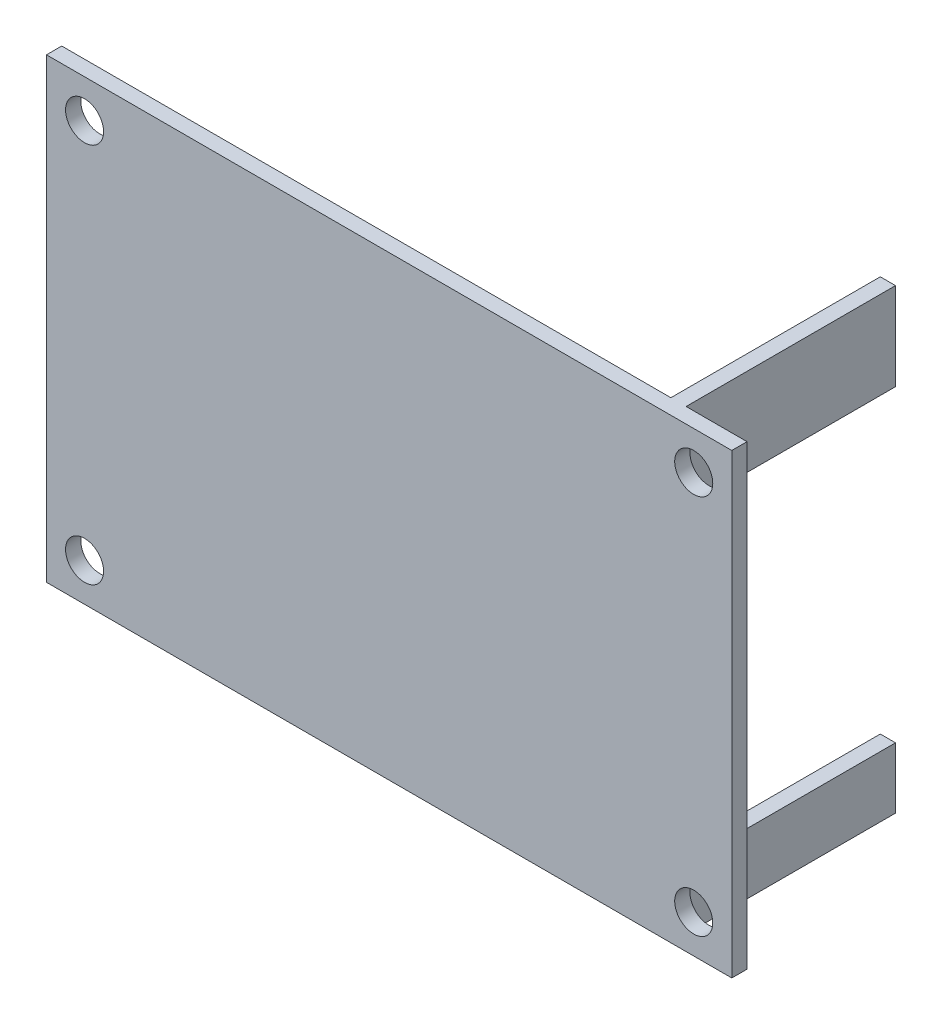
ISO-10303-21;
HEADER;
FILE_DESCRIPTION(('STEP AP214'),'2;1');
FILE_NAME('part.step','',(''),(''),'','','');
FILE_SCHEMA(('AUTOMOTIVE_DESIGN { 1 0 10303 214 1 1 1 1 }'));
ENDSEC;
DATA;
#1=APPLICATION_CONTEXT('core data for automotive mechanical design processes');
#2=APPLICATION_PROTOCOL_DEFINITION('international standard','automotive_design',2000,#1);
#3=PRODUCT_CONTEXT('',#1,'mechanical');
#4=PRODUCT('Part','Part','',(#3));
#5=PRODUCT_RELATED_PRODUCT_CATEGORY('part','',(#4));
#6=PRODUCT_DEFINITION_FORMATION('','',#4);
#7=PRODUCT_DEFINITION_CONTEXT('part definition',#1,'design');
#8=PRODUCT_DEFINITION('design','',#6,#7);
#9=PRODUCT_DEFINITION_SHAPE('','',#8);
#10=(LENGTH_UNIT() NAMED_UNIT(*) SI_UNIT(.MILLI.,.METRE.));
#11=(NAMED_UNIT(*) PLANE_ANGLE_UNIT() SI_UNIT($,.RADIAN.));
#12=(NAMED_UNIT(*) SI_UNIT($,.STERADIAN.) SOLID_ANGLE_UNIT());
#13=UNCERTAINTY_MEASURE_WITH_UNIT(LENGTH_MEASURE(1.E-05),#10,'distance_accuracy_value','');
#14=(GEOMETRIC_REPRESENTATION_CONTEXT(3) GLOBAL_UNCERTAINTY_ASSIGNED_CONTEXT((#13)) GLOBAL_UNIT_ASSIGNED_CONTEXT((#10,
#11,#12)) REPRESENTATION_CONTEXT('',''));
#15=CARTESIAN_POINT('',(0.,0.,0.));
#16=DIRECTION('',(0.,0.,1.));
#17=DIRECTION('',(1.,0.,0.));
#18=AXIS2_PLACEMENT_3D('',#15,#16,#17);
#19=CARTESIAN_POINT('',(0.,0.,-27.5));
#20=DIRECTION('',(0.,0.,1.));
#21=DIRECTION('',(1.,0.,0.));
#22=AXIS2_PLACEMENT_3D('',#19,#20,#21);
#23=PLANE('',#22);
#24=DIRECTION('',(0.,1.,0.));
#25=VECTOR('',#24,1.);
#26=CARTESIAN_POINT('',(35.,-30.,-27.5));
#27=LINE('',#26,#25);
#28=CARTESIAN_POINT('',(35.,-30.,-27.5));
#29=VERTEX_POINT('',#28);
#30=CARTESIAN_POINT('',(35.,-22.,-27.5));
#31=VERTEX_POINT('',#30);
#32=EDGE_CURVE('E154',#29,#31,#27,.T.);
#33=ORIENTED_EDGE('',*,*,#32,.T.);
#34=DIRECTION('',(1.,0.,0.));
#35=VECTOR('',#34,1.);
#36=CARTESIAN_POINT('',(0.,-22.,-27.5));
#37=LINE('',#36,#35);
#38=CARTESIAN_POINT('',(37.,-22.,-27.5));
#39=VERTEX_POINT('',#38);
#40=EDGE_CURVE('E40',#31,#39,#37,.T.);
#41=ORIENTED_EDGE('',*,*,#40,.T.);
#42=DIRECTION('',(0.,-1.,0.));
#43=VECTOR('',#42,1.);
#44=CARTESIAN_POINT('',(37.,-30.,-27.5));
#45=LINE('',#44,#43);
#46=CARTESIAN_POINT('',(37.,-30.,-27.5));
#47=VERTEX_POINT('',#46);
#48=EDGE_CURVE('E145',#39,#47,#45,.T.);
#49=ORIENTED_EDGE('',*,*,#48,.T.);
#50=DIRECTION('',(-1.,0.,0.));
#51=VECTOR('',#50,1.);
#52=CARTESIAN_POINT('',(37.,-30.,-27.5));
#53=LINE('',#52,#51);
#54=EDGE_CURVE('E144',#47,#29,#53,.T.);
#55=ORIENTED_EDGE('',*,*,#54,.T.);
#56=EDGE_LOOP('',(#33,#41,#49,#55));
#57=FACE_BOUND('',#56,.T.);
#58=ADVANCED_FACE('F32',(#57),#23,.F.);
#59=CARTESIAN_POINT('',(0.,0.,0.));
#60=DIRECTION('',(0.,0.,-1.));
#61=DIRECTION('',(-1.,0.,0.));
#62=AXIS2_PLACEMENT_3D('',#59,#60,#61);
#63=PLANE('',#62);
#64=DIRECTION('',(0.,-1.,0.));
#65=VECTOR('',#64,1.);
#66=CARTESIAN_POINT('',(37.,-30.,0.));
#67=LINE('',#66,#65);
#68=CARTESIAN_POINT('',(37.,30.,0.));
#69=VERTEX_POINT('',#68);
#70=CARTESIAN_POINT('',(37.,-30.,0.));
#71=VERTEX_POINT('',#70);
#72=EDGE_CURVE('E55',#69,#71,#67,.T.);
#73=ORIENTED_EDGE('',*,*,#72,.F.);
#74=DIRECTION('',(-1.,0.,0.));
#75=VECTOR('',#74,1.);
#76=CARTESIAN_POINT('',(-45.,30.,0.));
#77=LINE('',#76,#75);
#78=CARTESIAN_POINT('',(45.,30.,0.));
#79=VERTEX_POINT('',#78);
#80=EDGE_CURVE('E201',#79,#69,#77,.T.);
#81=ORIENTED_EDGE('',*,*,#80,.F.);
#82=DIRECTION('',(0.,1.,0.));
#83=VECTOR('',#82,1.);
#84=CARTESIAN_POINT('',(45.,-30.,0.));
#85=LINE('',#84,#83);
#86=CARTESIAN_POINT('',(45.,-30.,0.));
#87=VERTEX_POINT('',#86);
#88=EDGE_CURVE('E196',#87,#79,#85,.T.);
#89=ORIENTED_EDGE('',*,*,#88,.F.);
#90=DIRECTION('',(1.,0.,0.));
#91=VECTOR('',#90,1.);
#92=CARTESIAN_POINT('',(-45.,-30.,0.));
#93=LINE('',#92,#91);
#94=EDGE_CURVE('E205',#71,#87,#93,.T.);
#95=ORIENTED_EDGE('',*,*,#94,.F.);
#96=EDGE_LOOP('',(#73,#81,#89,#95));
#97=FACE_BOUND('',#96,.T.);
#98=CARTESIAN_POINT('',(40.,25.,0.));
#99=DIRECTION('',(0.,0.,-1.));
#100=DIRECTION('',(-1.,0.,0.));
#101=AXIS2_PLACEMENT_3D('',#98,#99,#100);
#102=CIRCLE('',#101,2.5);
#103=CARTESIAN_POINT('',(37.5,25.,0.));
#104=VERTEX_POINT('',#103);
#105=EDGE_CURVE('E223',#104,#104,#102,.T.);
#106=ORIENTED_EDGE('',*,*,#105,.F.);
#107=EDGE_LOOP('',(#106));
#108=FACE_BOUND('',#107,.T.);
#109=CARTESIAN_POINT('',(40.,-25.,0.));
#110=DIRECTION('',(0.,0.,-1.));
#111=DIRECTION('',(-1.,0.,0.));
#112=AXIS2_PLACEMENT_3D('',#109,#110,#111);
#113=CIRCLE('',#112,2.5);
#114=CARTESIAN_POINT('',(37.5,-25.,0.));
#115=VERTEX_POINT('',#114);
#116=EDGE_CURVE('E200',#115,#115,#113,.T.);
#117=ORIENTED_EDGE('',*,*,#116,.F.);
#118=EDGE_LOOP('',(#117));
#119=FACE_BOUND('',#118,.T.);
#120=ADVANCED_FACE('F261',(#97,#108,#119),#63,.T.);
#121=CARTESIAN_POINT('',(45.,-30.,2.));
#122=DIRECTION('',(-1.,0.,0.));
#123=DIRECTION('',(0.,0.,1.));
#124=AXIS2_PLACEMENT_3D('',#121,#122,#123);
#125=PLANE('',#124);
#126=ORIENTED_EDGE('',*,*,#88,.T.);
#127=DIRECTION('',(0.,0.,-1.));
#128=VECTOR('',#127,1.);
#129=CARTESIAN_POINT('',(45.,30.,2.));
#130=LINE('',#129,#128);
#131=CARTESIAN_POINT('',(45.,30.,2.));
#132=VERTEX_POINT('',#131);
#133=EDGE_CURVE('E128',#132,#79,#130,.T.);
#134=ORIENTED_EDGE('',*,*,#133,.F.);
#135=DIRECTION('',(0.,1.,0.));
#136=VECTOR('',#135,1.);
#137=CARTESIAN_POINT('',(45.,-30.,2.));
#138=LINE('',#137,#136);
#139=CARTESIAN_POINT('',(45.,-30.,2.));
#140=VERTEX_POINT('',#139);
#141=EDGE_CURVE('E185',#140,#132,#138,.T.);
#142=ORIENTED_EDGE('',*,*,#141,.F.);
#143=DIRECTION('',(0.,0.,-1.));
#144=VECTOR('',#143,1.);
#145=CARTESIAN_POINT('',(45.,-30.,2.));
#146=LINE('',#145,#144);
#147=EDGE_CURVE('E195',#140,#87,#146,.T.);
#148=ORIENTED_EDGE('',*,*,#147,.T.);
#149=EDGE_LOOP('',(#126,#134,#142,#148));
#150=FACE_BOUND('',#149,.T.);
#151=ADVANCED_FACE('F34',(#150),#125,.F.);
#152=CARTESIAN_POINT('',(-45.,30.,2.));
#153=DIRECTION('',(0.,-1.,0.));
#154=DIRECTION('',(0.,0.,-1.));
#155=AXIS2_PLACEMENT_3D('',#152,#153,#154);
#156=PLANE('',#155);
#157=ORIENTED_EDGE('',*,*,#80,.T.);
#158=DIRECTION('',(0.,0.,1.));
#159=VECTOR('',#158,1.);
#160=CARTESIAN_POINT('',(37.,30.,-27.5));
#161=LINE('',#160,#159);
#162=CARTESIAN_POINT('',(37.,30.,-27.5));
#163=VERTEX_POINT('',#162);
#164=EDGE_CURVE('E158',#163,#69,#161,.T.);
#165=ORIENTED_EDGE('',*,*,#164,.F.);
#166=DIRECTION('',(1.,0.,0.));
#167=VECTOR('',#166,1.);
#168=CARTESIAN_POINT('',(37.,30.,-27.5));
#169=LINE('',#168,#167);
#170=CARTESIAN_POINT('',(35.,30.,-27.5));
#171=VERTEX_POINT('',#170);
#172=EDGE_CURVE('E142',#171,#163,#169,.T.);
#173=ORIENTED_EDGE('',*,*,#172,.F.);
#174=DIRECTION('',(0.,0.,1.));
#175=VECTOR('',#174,1.);
#176=CARTESIAN_POINT('',(35.,30.,-27.5));
#177=LINE('',#176,#175);
#178=CARTESIAN_POINT('',(35.,30.,0.));
#179=VERTEX_POINT('',#178);
#180=EDGE_CURVE('E163',#171,#179,#177,.T.);
#181=ORIENTED_EDGE('',*,*,#180,.T.);
#182=CARTESIAN_POINT('',(-45.,30.,0.));
#183=VERTEX_POINT('',#182);
#184=EDGE_CURVE('E199',#179,#183,#77,.T.);
#185=ORIENTED_EDGE('',*,*,#184,.T.);
#186=DIRECTION('',(0.,0.,-1.));
#187=VECTOR('',#186,1.);
#188=CARTESIAN_POINT('',(-45.,30.,2.));
#189=LINE('',#188,#187);
#190=CARTESIAN_POINT('',(-45.,30.,2.));
#191=VERTEX_POINT('',#190);
#192=EDGE_CURVE('E213',#191,#183,#189,.T.);
#193=ORIENTED_EDGE('',*,*,#192,.F.);
#194=DIRECTION('',(-1.,0.,0.));
#195=VECTOR('',#194,1.);
#196=CARTESIAN_POINT('',(-45.,30.,2.));
#197=LINE('',#196,#195);
#198=EDGE_CURVE('E188',#132,#191,#197,.T.);
#199=ORIENTED_EDGE('',*,*,#198,.F.);
#200=ORIENTED_EDGE('',*,*,#133,.T.);
#201=EDGE_LOOP('',(#157,#165,#173,#181,#185,#193,#199,#200));
#202=FACE_BOUND('',#201,.T.);
#203=ADVANCED_FACE('F304',(#202),#156,.F.);
#204=CARTESIAN_POINT('',(-45.,-30.,2.));
#205=DIRECTION('',(1.,0.,0.));
#206=DIRECTION('',(0.,0.,-1.));
#207=AXIS2_PLACEMENT_3D('',#204,#205,#206);
#208=PLANE('',#207);
#209=DIRECTION('',(0.,-1.,0.));
#210=VECTOR('',#209,1.);
#211=CARTESIAN_POINT('',(-45.,-30.,0.));
#212=LINE('',#211,#210);
#213=CARTESIAN_POINT('',(-45.,-30.,0.));
#214=VERTEX_POINT('',#213);
#215=EDGE_CURVE('E203',#183,#214,#212,.T.);
#216=ORIENTED_EDGE('',*,*,#215,.T.);
#217=DIRECTION('',(0.,0.,-1.));
#218=VECTOR('',#217,1.);
#219=CARTESIAN_POINT('',(-45.,-30.,2.));
#220=LINE('',#219,#218);
#221=CARTESIAN_POINT('',(-45.,-30.,2.));
#222=VERTEX_POINT('',#221);
#223=EDGE_CURVE('E210',#222,#214,#220,.T.);
#224=ORIENTED_EDGE('',*,*,#223,.F.);
#225=DIRECTION('',(0.,-1.,0.));
#226=VECTOR('',#225,1.);
#227=CARTESIAN_POINT('',(-45.,-30.,2.));
#228=LINE('',#227,#226);
#229=EDGE_CURVE('E191',#191,#222,#228,.T.);
#230=ORIENTED_EDGE('',*,*,#229,.F.);
#231=ORIENTED_EDGE('',*,*,#192,.T.);
#232=EDGE_LOOP('',(#216,#224,#230,#231));
#233=FACE_BOUND('',#232,.T.);
#234=ADVANCED_FACE('F302',(#233),#208,.F.);
#235=CARTESIAN_POINT('',(-45.,-30.,2.));
#236=DIRECTION('',(0.,1.,0.));
#237=DIRECTION('',(0.,0.,1.));
#238=AXIS2_PLACEMENT_3D('',#235,#236,#237);
#239=PLANE('',#238);
#240=CARTESIAN_POINT('',(35.,-30.,0.));
#241=VERTEX_POINT('',#240);
#242=EDGE_CURVE('E189',#214,#241,#93,.T.);
#243=ORIENTED_EDGE('',*,*,#242,.T.);
#244=DIRECTION('',(0.,0.,1.));
#245=VECTOR('',#244,1.);
#246=CARTESIAN_POINT('',(35.,-30.,-27.5));
#247=LINE('',#246,#245);
#248=EDGE_CURVE('E166',#29,#241,#247,.T.);
#249=ORIENTED_EDGE('',*,*,#248,.F.);
#250=ORIENTED_EDGE('',*,*,#54,.F.);
#251=DIRECTION('',(0.,0.,1.));
#252=VECTOR('',#251,1.);
#253=CARTESIAN_POINT('',(37.,-30.,-27.5));
#254=LINE('',#253,#252);
#255=EDGE_CURVE('E169',#47,#71,#254,.T.);
#256=ORIENTED_EDGE('',*,*,#255,.T.);
#257=ORIENTED_EDGE('',*,*,#94,.T.);
#258=ORIENTED_EDGE('',*,*,#147,.F.);
#259=DIRECTION('',(1.,0.,0.));
#260=VECTOR('',#259,1.);
#261=CARTESIAN_POINT('',(-45.,-30.,2.));
#262=LINE('',#261,#260);
#263=EDGE_CURVE('E193',#222,#140,#262,.T.);
#264=ORIENTED_EDGE('',*,*,#263,.F.);
#265=ORIENTED_EDGE('',*,*,#223,.T.);
#266=EDGE_LOOP('',(#243,#249,#250,#256,#257,#258,#264,#265));
#267=FACE_BOUND('',#266,.T.);
#268=ADVANCED_FACE('F236',(#267),#239,.F.);
#269=CARTESIAN_POINT('',(0.,0.,2.));
#270=DIRECTION('',(0.,0.,-1.));
#271=DIRECTION('',(-1.,0.,0.));
#272=AXIS2_PLACEMENT_3D('',#269,#270,#271);
#273=PLANE('',#272);
#274=CARTESIAN_POINT('',(40.,-25.,2.));
#275=DIRECTION('',(0.,0.,1.));
#276=DIRECTION('',(1.,0.,0.));
#277=AXIS2_PLACEMENT_3D('',#274,#275,#276);
#278=CIRCLE('',#277,2.5);
#279=CARTESIAN_POINT('',(42.5,-25.,2.));
#280=VERTEX_POINT('',#279);
#281=EDGE_CURVE('E172',#280,#280,#278,.T.);
#282=ORIENTED_EDGE('',*,*,#281,.F.);
#283=EDGE_LOOP('',(#282));
#284=FACE_BOUND('',#283,.T.);
#285=CARTESIAN_POINT('',(40.,25.,2.));
#286=DIRECTION('',(0.,0.,1.));
#287=DIRECTION('',(1.,0.,0.));
#288=AXIS2_PLACEMENT_3D('',#285,#286,#287);
#289=CIRCLE('',#288,2.5);
#290=CARTESIAN_POINT('',(42.5,25.,2.));
#291=VERTEX_POINT('',#290);
#292=EDGE_CURVE('E177',#291,#291,#289,.T.);
#293=ORIENTED_EDGE('',*,*,#292,.F.);
#294=EDGE_LOOP('',(#293));
#295=FACE_BOUND('',#294,.T.);
#296=CARTESIAN_POINT('',(-40.,25.,2.));
#297=DIRECTION('',(0.,0.,1.));
#298=DIRECTION('',(1.,0.,0.));
#299=AXIS2_PLACEMENT_3D('',#296,#297,#298);
#300=CIRCLE('',#299,2.5);
#301=CARTESIAN_POINT('',(-37.5,25.,2.));
#302=VERTEX_POINT('',#301);
#303=EDGE_CURVE('E173',#302,#302,#300,.T.);
#304=ORIENTED_EDGE('',*,*,#303,.F.);
#305=EDGE_LOOP('',(#304));
#306=FACE_BOUND('',#305,.T.);
#307=CARTESIAN_POINT('',(-40.,-25.,2.));
#308=DIRECTION('',(0.,0.,1.));
#309=DIRECTION('',(1.,0.,0.));
#310=AXIS2_PLACEMENT_3D('',#307,#308,#309);
#311=CIRCLE('',#310,2.5);
#312=CARTESIAN_POINT('',(-37.5,-25.,2.));
#313=VERTEX_POINT('',#312);
#314=EDGE_CURVE('E176',#313,#313,#311,.T.);
#315=ORIENTED_EDGE('',*,*,#314,.F.);
#316=EDGE_LOOP('',(#315));
#317=FACE_BOUND('',#316,.T.);
#318=ORIENTED_EDGE('',*,*,#141,.T.);
#319=ORIENTED_EDGE('',*,*,#198,.T.);
#320=ORIENTED_EDGE('',*,*,#229,.T.);
#321=ORIENTED_EDGE('',*,*,#263,.T.);
#322=EDGE_LOOP('',(#318,#319,#320,#321));
#323=FACE_BOUND('',#322,.T.);
#324=ADVANCED_FACE('F294',(#284,#295,#306,#317,#323),#273,.F.);
#325=DIRECTION('',(0.,1.,0.));
#326=VECTOR('',#325,1.);
#327=CARTESIAN_POINT('',(35.,-30.,0.));
#328=LINE('',#327,#326);
#329=EDGE_CURVE('E149',#241,#179,#328,.T.);
#330=ORIENTED_EDGE('',*,*,#329,.F.);
#331=ORIENTED_EDGE('',*,*,#242,.F.);
#332=ORIENTED_EDGE('',*,*,#215,.F.);
#333=ORIENTED_EDGE('',*,*,#184,.F.);
#334=EDGE_LOOP('',(#330,#331,#332,#333));
#335=FACE_BOUND('',#334,.T.);
#336=CARTESIAN_POINT('',(-40.,25.,0.));
#337=DIRECTION('',(0.,0.,-1.));
#338=DIRECTION('',(-1.,0.,0.));
#339=AXIS2_PLACEMENT_3D('',#336,#337,#338);
#340=CIRCLE('',#339,2.5);
#341=CARTESIAN_POINT('',(-42.5,25.,0.));
#342=VERTEX_POINT('',#341);
#343=EDGE_CURVE('E220',#342,#342,#340,.T.);
#344=ORIENTED_EDGE('',*,*,#343,.F.);
#345=EDGE_LOOP('',(#344));
#346=FACE_BOUND('',#345,.T.);
#347=CARTESIAN_POINT('',(-40.,-25.,0.));
#348=DIRECTION('',(0.,0.,-1.));
#349=DIRECTION('',(-1.,0.,0.));
#350=AXIS2_PLACEMENT_3D('',#347,#348,#349);
#351=CIRCLE('',#350,2.5);
#352=CARTESIAN_POINT('',(-42.5,-25.,0.));
#353=VERTEX_POINT('',#352);
#354=EDGE_CURVE('E184',#353,#353,#351,.T.);
#355=ORIENTED_EDGE('',*,*,#354,.F.);
#356=EDGE_LOOP('',(#355));
#357=FACE_BOUND('',#356,.T.);
#358=ADVANCED_FACE('F267',(#335,#346,#357),#63,.T.);
#359=CARTESIAN_POINT('',(-40.,-25.,-8.));
#360=DIRECTION('',(0.,0.,1.));
#361=DIRECTION('',(1.,0.,0.));
#362=AXIS2_PLACEMENT_3D('',#359,#360,#361);
#363=CYLINDRICAL_SURFACE('',#362,2.5);
#364=ORIENTED_EDGE('',*,*,#354,.T.);
#365=EDGE_LOOP('',(#364));
#366=FACE_BOUND('',#365,.T.);
#367=ORIENTED_EDGE('',*,*,#314,.T.);
#368=EDGE_LOOP('',(#367));
#369=FACE_BOUND('',#368,.T.);
#370=ADVANCED_FACE('F283',(#366,#369),#363,.F.);
#371=CARTESIAN_POINT('',(-40.,25.,-8.));
#372=DIRECTION('',(0.,0.,1.));
#373=DIRECTION('',(1.,0.,0.));
#374=AXIS2_PLACEMENT_3D('',#371,#372,#373);
#375=CYLINDRICAL_SURFACE('',#374,2.5);
#376=ORIENTED_EDGE('',*,*,#343,.T.);
#377=EDGE_LOOP('',(#376));
#378=FACE_BOUND('',#377,.T.);
#379=ORIENTED_EDGE('',*,*,#303,.T.);
#380=EDGE_LOOP('',(#379));
#381=FACE_BOUND('',#380,.T.);
#382=ADVANCED_FACE('F279',(#378,#381),#375,.F.);
#383=CARTESIAN_POINT('',(40.,25.,-8.));
#384=DIRECTION('',(0.,0.,1.));
#385=DIRECTION('',(1.,0.,0.));
#386=AXIS2_PLACEMENT_3D('',#383,#384,#385);
#387=CYLINDRICAL_SURFACE('',#386,2.5);
#388=ORIENTED_EDGE('',*,*,#105,.T.);
#389=EDGE_LOOP('',(#388));
#390=FACE_BOUND('',#389,.T.);
#391=ORIENTED_EDGE('',*,*,#292,.T.);
#392=EDGE_LOOP('',(#391));
#393=FACE_BOUND('',#392,.T.);
#394=ADVANCED_FACE('F282',(#390,#393),#387,.F.);
#395=CARTESIAN_POINT('',(40.,-25.,-8.));
#396=DIRECTION('',(0.,0.,1.));
#397=DIRECTION('',(1.,0.,0.));
#398=AXIS2_PLACEMENT_3D('',#395,#396,#397);
#399=CYLINDRICAL_SURFACE('',#398,2.5);
#400=ORIENTED_EDGE('',*,*,#116,.T.);
#401=EDGE_LOOP('',(#400));
#402=FACE_BOUND('',#401,.T.);
#403=ORIENTED_EDGE('',*,*,#281,.T.);
#404=EDGE_LOOP('',(#403));
#405=FACE_BOUND('',#404,.T.);
#406=ADVANCED_FACE('F276',(#402,#405),#399,.F.);
#407=CARTESIAN_POINT('',(37.,-30.,-27.5));
#408=DIRECTION('',(-1.,0.,0.));
#409=DIRECTION('',(0.,-1.,0.));
#410=AXIS2_PLACEMENT_3D('',#407,#408,#409);
#411=PLANE('',#410);
#412=ORIENTED_EDGE('',*,*,#48,.F.);
#413=DIRECTION('',(0.,0.,-1.));
#414=VECTOR('',#413,1.);
#415=CARTESIAN_POINT('',(37.,-22.,-27.5));
#416=LINE('',#415,#414);
#417=CARTESIAN_POINT('',(37.,-22.,-7.50000000000001));
#418=VERTEX_POINT('',#417);
#419=EDGE_CURVE('E234',#418,#39,#416,.T.);
#420=ORIENTED_EDGE('',*,*,#419,.F.);
#421=DIRECTION('',(0.,-1.,0.));
#422=VECTOR('',#421,1.);
#423=CARTESIAN_POINT('',(37.,18.5,-7.5));
#424=LINE('',#423,#422);
#425=CARTESIAN_POINT('',(37.,18.5,-7.5));
#426=VERTEX_POINT('',#425);
#427=EDGE_CURVE('E138',#426,#418,#424,.T.);
#428=ORIENTED_EDGE('',*,*,#427,.F.);
#429=DIRECTION('',(0.,0.,1.));
#430=VECTOR('',#429,1.);
#431=CARTESIAN_POINT('',(37.,18.5,-27.5));
#432=LINE('',#431,#430);
#433=CARTESIAN_POINT('',(37.,18.5,-27.5));
#434=VERTEX_POINT('',#433);
#435=EDGE_CURVE('E123',#434,#426,#432,.T.);
#436=ORIENTED_EDGE('',*,*,#435,.F.);
#437=EDGE_CURVE('E135',#163,#434,#45,.T.);
#438=ORIENTED_EDGE('',*,*,#437,.F.);
#439=ORIENTED_EDGE('',*,*,#164,.T.);
#440=ORIENTED_EDGE('',*,*,#72,.T.);
#441=ORIENTED_EDGE('',*,*,#255,.F.);
#442=EDGE_LOOP('',(#412,#420,#428,#436,#438,#439,#440,#441));
#443=FACE_BOUND('',#442,.T.);
#444=ADVANCED_FACE('F133',(#443),#411,.F.);
#445=CARTESIAN_POINT('',(35.,-30.,-27.5));
#446=DIRECTION('',(1.,0.,0.));
#447=DIRECTION('',(0.,0.,-1.));
#448=AXIS2_PLACEMENT_3D('',#445,#446,#447);
#449=PLANE('',#448);
#450=DIRECTION('',(0.,-1.,0.));
#451=VECTOR('',#450,1.);
#452=CARTESIAN_POINT('',(35.,-30.,-7.50000000000001));
#453=LINE('',#452,#451);
#454=CARTESIAN_POINT('',(35.,18.5,-7.5));
#455=VERTEX_POINT('',#454);
#456=CARTESIAN_POINT('',(35.,-22.,-7.50000000000001));
#457=VERTEX_POINT('',#456);
#458=EDGE_CURVE('E11',#455,#457,#453,.T.);
#459=ORIENTED_EDGE('',*,*,#458,.T.);
#460=DIRECTION('',(0.,0.,-1.));
#461=VECTOR('',#460,1.);
#462=CARTESIAN_POINT('',(35.,-22.,-27.5));
#463=LINE('',#462,#461);
#464=EDGE_CURVE('E151',#457,#31,#463,.T.);
#465=ORIENTED_EDGE('',*,*,#464,.T.);
#466=ORIENTED_EDGE('',*,*,#32,.F.);
#467=ORIENTED_EDGE('',*,*,#248,.T.);
#468=ORIENTED_EDGE('',*,*,#329,.T.);
#469=ORIENTED_EDGE('',*,*,#180,.F.);
#470=CARTESIAN_POINT('',(35.,18.5,-27.5));
#471=VERTEX_POINT('',#470);
#472=EDGE_CURVE('E147',#471,#171,#27,.T.);
#473=ORIENTED_EDGE('',*,*,#472,.F.);
#474=DIRECTION('',(0.,0.,1.));
#475=VECTOR('',#474,1.);
#476=CARTESIAN_POINT('',(35.,18.5,-27.5));
#477=LINE('',#476,#475);
#478=EDGE_CURVE('E47',#471,#455,#477,.T.);
#479=ORIENTED_EDGE('',*,*,#478,.T.);
#480=EDGE_LOOP('',(#459,#465,#466,#467,#468,#469,#473,#479));
#481=FACE_BOUND('',#480,.T.);
#482=ADVANCED_FACE('F241',(#481),#449,.F.);
#483=ORIENTED_EDGE('',*,*,#437,.T.);
#484=DIRECTION('',(-1.,0.,0.));
#485=VECTOR('',#484,1.);
#486=CARTESIAN_POINT('',(0.,18.5,-27.5));
#487=LINE('',#486,#485);
#488=EDGE_CURVE('E120',#434,#471,#487,.T.);
#489=ORIENTED_EDGE('',*,*,#488,.T.);
#490=ORIENTED_EDGE('',*,*,#472,.T.);
#491=ORIENTED_EDGE('',*,*,#172,.T.);
#492=EDGE_LOOP('',(#483,#489,#490,#491));
#493=FACE_BOUND('',#492,.T.);
#494=ADVANCED_FACE('F140',(#493),#23,.F.);
#495=CARTESIAN_POINT('',(27.,18.5,-7.5));
#496=DIRECTION('',(0.,0.,1.));
#497=DIRECTION('',(0.,-1.,0.));
#498=AXIS2_PLACEMENT_3D('',#495,#496,#497);
#499=PLANE('',#498);
#500=DIRECTION('',(1.,0.,0.));
#501=VECTOR('',#500,1.);
#502=CARTESIAN_POINT('',(27.,18.5,-7.5));
#503=LINE('',#502,#501);
#504=EDGE_CURVE('E244',#455,#426,#503,.T.);
#505=ORIENTED_EDGE('',*,*,#504,.T.);
#506=ORIENTED_EDGE('',*,*,#427,.T.);
#507=DIRECTION('',(1.,0.,0.));
#508=VECTOR('',#507,1.);
#509=CARTESIAN_POINT('',(27.,-22.,-7.50000000000001));
#510=LINE('',#509,#508);
#511=EDGE_CURVE('E243',#457,#418,#510,.T.);
#512=ORIENTED_EDGE('',*,*,#511,.F.);
#513=ORIENTED_EDGE('',*,*,#458,.F.);
#514=EDGE_LOOP('',(#505,#506,#512,#513));
#515=FACE_BOUND('',#514,.T.);
#516=ADVANCED_FACE('F250',(#515),#499,.F.);
#517=CARTESIAN_POINT('',(27.,-22.,-27.5));
#518=DIRECTION('',(0.,-1.,0.));
#519=DIRECTION('',(0.,0.,-1.));
#520=AXIS2_PLACEMENT_3D('',#517,#518,#519);
#521=PLANE('',#520);
#522=ORIENTED_EDGE('',*,*,#511,.T.);
#523=ORIENTED_EDGE('',*,*,#419,.T.);
#524=ORIENTED_EDGE('',*,*,#40,.F.);
#525=ORIENTED_EDGE('',*,*,#464,.F.);
#526=EDGE_LOOP('',(#522,#523,#524,#525));
#527=FACE_BOUND('',#526,.T.);
#528=ADVANCED_FACE('F251',(#527),#521,.F.);
#529=CARTESIAN_POINT('',(27.,18.5,-27.5));
#530=DIRECTION('',(0.,1.,0.));
#531=DIRECTION('',(0.,0.,1.));
#532=AXIS2_PLACEMENT_3D('',#529,#530,#531);
#533=PLANE('',#532);
#534=ORIENTED_EDGE('',*,*,#488,.F.);
#535=ORIENTED_EDGE('',*,*,#435,.T.);
#536=ORIENTED_EDGE('',*,*,#504,.F.);
#537=ORIENTED_EDGE('',*,*,#478,.F.);
#538=EDGE_LOOP('',(#534,#535,#536,#537));
#539=FACE_BOUND('',#538,.T.);
#540=ADVANCED_FACE('F122',(#539),#533,.F.);
#541=CLOSED_SHELL('',(#58,#120,#151,#203,#234,#268,#324,#358,#370,#382,#394,#406,#444,#482,#494,
#516,#528,#540));
#542=MANIFOLD_SOLID_BREP('B2',#541);
#543=ADVANCED_BREP_SHAPE_REPRESENTATION('',(#18,#542),#14);
#544=SHAPE_DEFINITION_REPRESENTATION(#9,#543);
ENDSEC;
END-ISO-10303-21;
